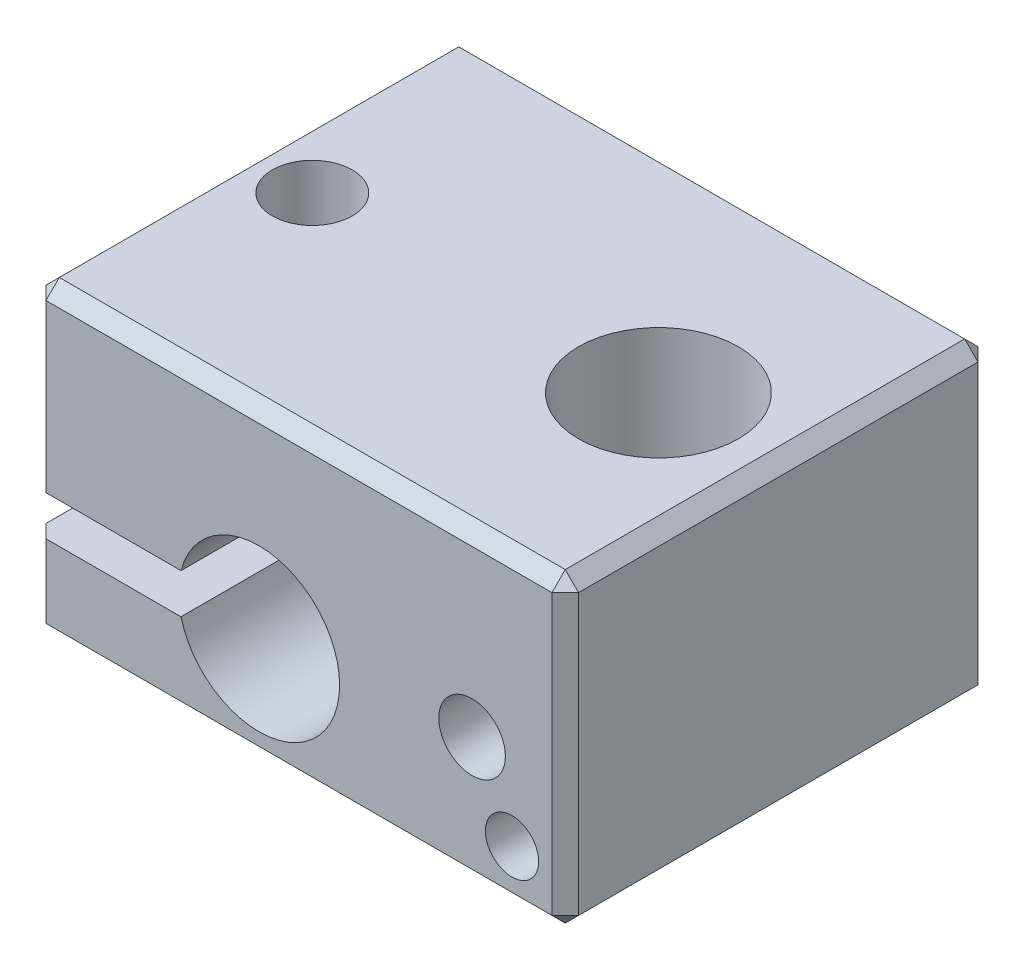
ISO-10303-21;
HEADER;
FILE_DESCRIPTION(('STEP AP214'),'2;1');
FILE_NAME('part.step','',(''),(''),'','','');
FILE_SCHEMA(('AUTOMOTIVE_DESIGN { 1 0 10303 214 1 1 1 1 }'));
ENDSEC;
DATA;
#1=APPLICATION_CONTEXT('core data for automotive mechanical design processes');
#2=APPLICATION_PROTOCOL_DEFINITION('international standard','automotive_design',2000,#1);
#3=PRODUCT_CONTEXT('',#1,'mechanical');
#4=PRODUCT('Part','Part','',(#3));
#5=PRODUCT_RELATED_PRODUCT_CATEGORY('part','',(#4));
#6=PRODUCT_DEFINITION_FORMATION('','',#4);
#7=PRODUCT_DEFINITION_CONTEXT('part definition',#1,'design');
#8=PRODUCT_DEFINITION('design','',#6,#7);
#9=PRODUCT_DEFINITION_SHAPE('','',#8);
#10=(LENGTH_UNIT() NAMED_UNIT(*) SI_UNIT(.MILLI.,.METRE.));
#11=(NAMED_UNIT(*) PLANE_ANGLE_UNIT() SI_UNIT($,.RADIAN.));
#12=(NAMED_UNIT(*) SI_UNIT($,.STERADIAN.) SOLID_ANGLE_UNIT());
#13=UNCERTAINTY_MEASURE_WITH_UNIT(LENGTH_MEASURE(1.E-05),#10,'distance_accuracy_value','');
#14=(GEOMETRIC_REPRESENTATION_CONTEXT(3) GLOBAL_UNCERTAINTY_ASSIGNED_CONTEXT((#13)) GLOBAL_UNIT_ASSIGNED_CONTEXT((#10,
#11,#12)) REPRESENTATION_CONTEXT('',''));
#15=CARTESIAN_POINT('',(0.,0.,0.));
#16=DIRECTION('',(0.,0.,1.));
#17=DIRECTION('',(1.,0.,0.));
#18=AXIS2_PLACEMENT_3D('',#15,#16,#17);
#19=CARTESIAN_POINT('',(0.,0.,16.));
#20=DIRECTION('',(-1.,0.,0.));
#21=DIRECTION('',(0.,0.,1.));
#22=AXIS2_PLACEMENT_3D('',#19,#20,#21);
#23=PLANE('',#22);
#24=DIRECTION('',(0.,-1.,0.));
#25=VECTOR('',#24,1.);
#26=CARTESIAN_POINT('',(0.,0.,15.5));
#27=LINE('',#26,#25);
#28=CARTESIAN_POINT('',(0.,11.,15.5));
#29=VERTEX_POINT('',#28);
#30=CARTESIAN_POINT('',(0.,0.500000000000004,15.5));
#31=VERTEX_POINT('',#30);
#32=EDGE_CURVE('E289',#29,#31,#27,.T.);
#33=ORIENTED_EDGE('',*,*,#32,.T.);
#34=DIRECTION('',(0.,0.,-1.));
#35=VECTOR('',#34,1.);
#36=CARTESIAN_POINT('',(0.,0.500000000000004,16.));
#37=LINE('',#36,#35);
#38=CARTESIAN_POINT('',(0.,0.500000000000004,0.500000000000004));
#39=VERTEX_POINT('',#38);
#40=EDGE_CURVE('E291',#31,#39,#37,.T.);
#41=ORIENTED_EDGE('',*,*,#40,.T.);
#42=DIRECTION('',(0.,1.,0.));
#43=VECTOR('',#42,1.);
#44=CARTESIAN_POINT('',(0.,0.,0.500000000000004));
#45=LINE('',#44,#43);
#46=CARTESIAN_POINT('',(0.,11.,0.500000000000004));
#47=VERTEX_POINT('',#46);
#48=EDGE_CURVE('E287',#39,#47,#45,.T.);
#49=ORIENTED_EDGE('',*,*,#48,.T.);
#50=DIRECTION('',(0.,0.,1.));
#51=VECTOR('',#50,1.);
#52=CARTESIAN_POINT('',(0.,11.,16.));
#53=LINE('',#52,#51);
#54=EDGE_CURVE('E285',#47,#29,#53,.T.);
#55=ORIENTED_EDGE('',*,*,#54,.T.);
#56=EDGE_LOOP('',(#33,#41,#49,#55));
#57=FACE_BOUND('',#56,.T.);
#58=ADVANCED_FACE('F39',(#57),#23,.F.);
#59=CARTESIAN_POINT('',(0.,11.5,16.));
#60=DIRECTION('',(0.,-1.,0.));
#61=DIRECTION('',(1.,0.,0.));
#62=AXIS2_PLACEMENT_3D('',#59,#60,#61);
#63=PLANE('',#62);
#64=DIRECTION('',(-1.,0.,0.));
#65=VECTOR('',#64,1.);
#66=CARTESIAN_POINT('',(0.,11.5,0.500000000000004));
#67=LINE('',#66,#65);
#68=CARTESIAN_POINT('',(-0.500000000000004,11.5,0.500000000000004));
#69=VERTEX_POINT('',#68);
#70=CARTESIAN_POINT('',(-19.5,11.5,0.500000000000004));
#71=VERTEX_POINT('',#70);
#72=EDGE_CURVE('E48',#69,#71,#67,.T.);
#73=ORIENTED_EDGE('',*,*,#72,.T.);
#74=DIRECTION('',(0.,0.,1.));
#75=VECTOR('',#74,1.);
#76=CARTESIAN_POINT('',(-19.5,11.5,16.));
#77=LINE('',#76,#75);
#78=CARTESIAN_POINT('',(-19.5,11.5,15.5));
#79=VERTEX_POINT('',#78);
#80=EDGE_CURVE('E11',#71,#79,#77,.T.);
#81=ORIENTED_EDGE('',*,*,#80,.T.);
#82=DIRECTION('',(1.,0.,0.));
#83=VECTOR('',#82,1.);
#84=CARTESIAN_POINT('',(0.,11.5,15.5));
#85=LINE('',#84,#83);
#86=CARTESIAN_POINT('',(-0.500000000000004,11.5,15.5));
#87=VERTEX_POINT('',#86);
#88=EDGE_CURVE('E294',#79,#87,#85,.T.);
#89=ORIENTED_EDGE('',*,*,#88,.T.);
#90=DIRECTION('',(0.,0.,-1.));
#91=VECTOR('',#90,1.);
#92=CARTESIAN_POINT('',(-0.500000000000004,11.5,16.));
#93=LINE('',#92,#91);
#94=EDGE_CURVE('E59',#87,#69,#93,.T.);
#95=ORIENTED_EDGE('',*,*,#94,.T.);
#96=EDGE_LOOP('',(#73,#81,#89,#95));
#97=FACE_BOUND('',#96,.T.);
#98=CARTESIAN_POINT('',(-4.5,11.5,8.));
#99=DIRECTION('',(0.,1.,0.));
#100=DIRECTION('',(-1.,0.,0.));
#101=AXIS2_PLACEMENT_3D('',#98,#99,#100);
#102=CIRCLE('',#101,3.);
#103=CARTESIAN_POINT('',(-7.5,11.5,8.));
#104=VERTEX_POINT('',#103);
#105=EDGE_CURVE('E191',#104,#104,#102,.T.);
#106=ORIENTED_EDGE('',*,*,#105,.F.);
#107=EDGE_LOOP('',(#106));
#108=FACE_BOUND('',#107,.T.);
#109=CARTESIAN_POINT('',(-17.5,11.5,8.));
#110=DIRECTION('',(0.,1.,0.));
#111=DIRECTION('',(-1.,0.,0.));
#112=AXIS2_PLACEMENT_3D('',#109,#110,#111);
#113=CIRCLE('',#112,1.5);
#114=CARTESIAN_POINT('',(-19.,11.5,8.));
#115=VERTEX_POINT('',#114);
#116=EDGE_CURVE('E197',#115,#115,#113,.T.);
#117=ORIENTED_EDGE('',*,*,#116,.F.);
#118=EDGE_LOOP('',(#117));
#119=FACE_BOUND('',#118,.T.);
#120=ADVANCED_FACE('F387',(#97,#108,#119),#63,.F.);
#121=CARTESIAN_POINT('',(-20.,4.75,16.));
#122=DIRECTION('',(1.,0.,0.));
#123=DIRECTION('',(0.,1.,0.));
#124=AXIS2_PLACEMENT_3D('',#121,#122,#123);
#125=PLANE('',#124);
#126=DIRECTION('',(0.,0.,-1.));
#127=VECTOR('',#126,1.);
#128=CARTESIAN_POINT('',(-20.,11.,16.));
#129=LINE('',#128,#127);
#130=CARTESIAN_POINT('',(-20.,11.,15.5));
#131=VERTEX_POINT('',#130);
#132=CARTESIAN_POINT('',(-20.,11.,0.500000000000004));
#133=VERTEX_POINT('',#132);
#134=EDGE_CURVE('E265',#131,#133,#129,.T.);
#135=ORIENTED_EDGE('',*,*,#134,.T.);
#136=DIRECTION('',(0.,-1.,0.));
#137=VECTOR('',#136,1.);
#138=CARTESIAN_POINT('',(-20.,4.75,0.500000000000004));
#139=LINE('',#138,#137);
#140=CARTESIAN_POINT('',(-20.,4.75,0.500000000000008));
#141=VERTEX_POINT('',#140);
#142=EDGE_CURVE('E269',#133,#141,#139,.T.);
#143=ORIENTED_EDGE('',*,*,#142,.T.);
#144=DIRECTION('',(0.,0.,-1.));
#145=VECTOR('',#144,1.);
#146=CARTESIAN_POINT('',(-20.,4.75,16.));
#147=LINE('',#146,#145);
#148=CARTESIAN_POINT('',(-20.,4.75,15.5));
#149=VERTEX_POINT('',#148);
#150=EDGE_CURVE('E232',#149,#141,#147,.T.);
#151=ORIENTED_EDGE('',*,*,#150,.F.);
#152=DIRECTION('',(0.,1.,0.));
#153=VECTOR('',#152,1.);
#154=CARTESIAN_POINT('',(-20.,11.5,15.5));
#155=LINE('',#154,#153);
#156=EDGE_CURVE('E267',#149,#131,#155,.T.);
#157=ORIENTED_EDGE('',*,*,#156,.T.);
#158=EDGE_LOOP('',(#135,#143,#151,#157));
#159=FACE_BOUND('',#158,.T.);
#160=ADVANCED_FACE('F393',(#159),#125,.F.);
#161=CARTESIAN_POINT('',(-20.,4.75,16.));
#162=DIRECTION('',(0.,1.,0.));
#163=DIRECTION('',(0.,0.,1.));
#164=AXIS2_PLACEMENT_3D('',#161,#162,#163);
#165=PLANE('',#164);
#166=CARTESIAN_POINT('',(-17.5,4.75,8.));
#167=DIRECTION('',(0.,1.,0.));
#168=DIRECTION('',(0.,0.,1.));
#169=AXIS2_PLACEMENT_3D('',#166,#167,#168);
#170=CIRCLE('',#169,1.5);
#171=CARTESIAN_POINT('',(-17.5,4.75,9.5));
#172=VERTEX_POINT('',#171);
#173=EDGE_CURVE('E206',#172,#172,#170,.T.);
#174=ORIENTED_EDGE('',*,*,#173,.T.);
#175=EDGE_LOOP('',(#174));
#176=FACE_BOUND('',#175,.T.);
#177=ORIENTED_EDGE('',*,*,#150,.T.);
#178=DIRECTION('',(-0.707106781186545,0.,0.70710678118655));
#179=VECTOR('',#178,1.);
#180=CARTESIAN_POINT('',(-20.,4.75,0.500000000000004));
#181=LINE('',#180,#179);
#182=CARTESIAN_POINT('',(-19.5,4.75,0.));
#183=VERTEX_POINT('',#182);
#184=EDGE_CURVE('E273',#141,#183,#181,.F.);
#185=ORIENTED_EDGE('',*,*,#184,.T.);
#186=DIRECTION('',(1.,0.,0.));
#187=VECTOR('',#186,1.);
#188=CARTESIAN_POINT('',(-20.,4.75,0.));
#189=LINE('',#188,#187);
#190=CARTESIAN_POINT('',(-14.4305502896214,4.75,0.));
#191=VERTEX_POINT('',#190);
#192=EDGE_CURVE('E209',#183,#191,#189,.T.);
#193=ORIENTED_EDGE('',*,*,#192,.T.);
#194=DIRECTION('',(0.,0.,-1.));
#195=VECTOR('',#194,1.);
#196=CARTESIAN_POINT('',(-14.4305502896214,4.75,16.));
#197=LINE('',#196,#195);
#198=CARTESIAN_POINT('',(-14.4305502896214,4.75,16.));
#199=VERTEX_POINT('',#198);
#200=EDGE_CURVE('E229',#199,#191,#197,.T.);
#201=ORIENTED_EDGE('',*,*,#200,.F.);
#202=DIRECTION('',(1.,0.,0.));
#203=VECTOR('',#202,1.);
#204=CARTESIAN_POINT('',(-20.,4.75,16.));
#205=LINE('',#204,#203);
#206=CARTESIAN_POINT('',(-19.5,4.75,16.));
#207=VERTEX_POINT('',#206);
#208=EDGE_CURVE('E210',#207,#199,#205,.T.);
#209=ORIENTED_EDGE('',*,*,#208,.F.);
#210=DIRECTION('',(-0.707106781186545,0.,-0.70710678118655));
#211=VECTOR('',#210,1.);
#212=CARTESIAN_POINT('',(-19.5,4.75,16.));
#213=LINE('',#212,#211);
#214=EDGE_CURVE('E271',#207,#149,#213,.T.);
#215=ORIENTED_EDGE('',*,*,#214,.T.);
#216=EDGE_LOOP('',(#177,#185,#193,#201,#209,#215));
#217=FACE_BOUND('',#216,.T.);
#218=ADVANCED_FACE('F493',(#176,#217),#165,.F.);
#219=CARTESIAN_POINT('',(-11.5,4.,16.));
#220=DIRECTION('',(0.,0.,-1.));
#221=DIRECTION('',(-1.,0.,0.));
#222=AXIS2_PLACEMENT_3D('',#219,#220,#221);
#223=CYLINDRICAL_SURFACE('',#222,3.025);
#224=CARTESIAN_POINT('',(-11.5,4.,0.));
#225=DIRECTION('',(0.,0.,-1.));
#226=DIRECTION('',(1.,0.,0.));
#227=AXIS2_PLACEMENT_3D('',#224,#225,#226);
#228=CIRCLE('',#227,3.025);
#229=CARTESIAN_POINT('',(-14.4305502896214,3.25,0.));
#230=VERTEX_POINT('',#229);
#231=EDGE_CURVE('E220',#191,#230,#228,.T.);
#232=ORIENTED_EDGE('',*,*,#231,.T.);
#233=DIRECTION('',(0.,0.,-1.));
#234=VECTOR('',#233,1.);
#235=CARTESIAN_POINT('',(-14.4305502896214,3.25,16.));
#236=LINE('',#235,#234);
#237=CARTESIAN_POINT('',(-14.4305502896214,3.25,16.));
#238=VERTEX_POINT('',#237);
#239=EDGE_CURVE('E226',#238,#230,#236,.T.);
#240=ORIENTED_EDGE('',*,*,#239,.F.);
#241=CARTESIAN_POINT('',(-11.5,4.,16.));
#242=DIRECTION('',(0.,0.,-1.));
#243=DIRECTION('',(1.,0.,0.));
#244=AXIS2_PLACEMENT_3D('',#241,#242,#243);
#245=CIRCLE('',#244,3.025);
#246=EDGE_CURVE('E212',#199,#238,#245,.T.);
#247=ORIENTED_EDGE('',*,*,#246,.F.);
#248=ORIENTED_EDGE('',*,*,#200,.T.);
#249=EDGE_LOOP('',(#232,#240,#247,#248));
#250=FACE_BOUND('',#249,.T.);
#251=ADVANCED_FACE('F501',(#250),#223,.F.);
#252=CARTESIAN_POINT('',(-14.4305502896214,3.25,16.));
#253=DIRECTION('',(0.,-1.,0.));
#254=DIRECTION('',(1.,0.,0.));
#255=AXIS2_PLACEMENT_3D('',#252,#253,#254);
#256=PLANE('',#255);
#257=CARTESIAN_POINT('',(-17.5,3.25,8.));
#258=DIRECTION('',(0.,-1.,0.));
#259=DIRECTION('',(1.,0.,0.));
#260=AXIS2_PLACEMENT_3D('',#257,#258,#259);
#261=CIRCLE('',#260,1.5);
#262=CARTESIAN_POINT('',(-16.,3.25,8.));
#263=VERTEX_POINT('',#262);
#264=EDGE_CURVE('E203',#263,#263,#261,.T.);
#265=ORIENTED_EDGE('',*,*,#264,.T.);
#266=EDGE_LOOP('',(#265));
#267=FACE_BOUND('',#266,.T.);
#268=DIRECTION('',(-1.,0.,0.));
#269=VECTOR('',#268,1.);
#270=CARTESIAN_POINT('',(-14.4305502896214,3.25,0.));
#271=LINE('',#270,#269);
#272=CARTESIAN_POINT('',(-19.5,3.25,0.));
#273=VERTEX_POINT('',#272);
#274=EDGE_CURVE('E213',#230,#273,#271,.T.);
#275=ORIENTED_EDGE('',*,*,#274,.T.);
#276=DIRECTION('',(0.707106781186548,0.,-0.707106781186548));
#277=VECTOR('',#276,1.);
#278=CARTESIAN_POINT('',(-20.,3.25,0.500000000000004));
#279=LINE('',#278,#277);
#280=CARTESIAN_POINT('',(-20.,3.25,0.500000000000008));
#281=VERTEX_POINT('',#280);
#282=EDGE_CURVE('E263',#273,#281,#279,.F.);
#283=ORIENTED_EDGE('',*,*,#282,.T.);
#284=DIRECTION('',(0.,0.,-1.));
#285=VECTOR('',#284,1.);
#286=CARTESIAN_POINT('',(-20.,3.25,16.));
#287=LINE('',#286,#285);
#288=CARTESIAN_POINT('',(-20.,3.25,15.5));
#289=VERTEX_POINT('',#288);
#290=EDGE_CURVE('E218',#289,#281,#287,.T.);
#291=ORIENTED_EDGE('',*,*,#290,.F.);
#292=DIRECTION('',(0.707106781186548,0.,0.707106781186548));
#293=VECTOR('',#292,1.);
#294=CARTESIAN_POINT('',(-19.5,3.25,16.));
#295=LINE('',#294,#293);
#296=CARTESIAN_POINT('',(-19.5,3.25,16.));
#297=VERTEX_POINT('',#296);
#298=EDGE_CURVE('E261',#289,#297,#295,.T.);
#299=ORIENTED_EDGE('',*,*,#298,.T.);
#300=DIRECTION('',(-1.,0.,0.));
#301=VECTOR('',#300,1.);
#302=CARTESIAN_POINT('',(-14.4305502896214,3.25,16.));
#303=LINE('',#302,#301);
#304=EDGE_CURVE('E215',#238,#297,#303,.T.);
#305=ORIENTED_EDGE('',*,*,#304,.F.);
#306=ORIENTED_EDGE('',*,*,#239,.T.);
#307=EDGE_LOOP('',(#275,#283,#291,#299,#305,#306));
#308=FACE_BOUND('',#307,.T.);
#309=ADVANCED_FACE('F505',(#267,#308),#256,.F.);
#310=CARTESIAN_POINT('',(-20.,0.,16.));
#311=DIRECTION('',(1.,0.,0.));
#312=DIRECTION('',(0.,0.,-1.));
#313=AXIS2_PLACEMENT_3D('',#310,#311,#312);
#314=PLANE('',#313);
#315=ORIENTED_EDGE('',*,*,#290,.T.);
#316=DIRECTION('',(0.,-1.,0.));
#317=VECTOR('',#316,1.);
#318=CARTESIAN_POINT('',(-20.,0.,0.500000000000004));
#319=LINE('',#318,#317);
#320=CARTESIAN_POINT('',(-20.,0.500000000000002,0.500000000000004));
#321=VERTEX_POINT('',#320);
#322=EDGE_CURVE('E259',#281,#321,#319,.T.);
#323=ORIENTED_EDGE('',*,*,#322,.T.);
#324=DIRECTION('',(0.,0.,1.));
#325=VECTOR('',#324,1.);
#326=CARTESIAN_POINT('',(-20.,0.500000000000002,16.));
#327=LINE('',#326,#325);
#328=CARTESIAN_POINT('',(-20.,0.500000000000002,15.5));
#329=VERTEX_POINT('',#328);
#330=EDGE_CURVE('E257',#321,#329,#327,.T.);
#331=ORIENTED_EDGE('',*,*,#330,.T.);
#332=DIRECTION('',(0.,1.,0.));
#333=VECTOR('',#332,1.);
#334=CARTESIAN_POINT('',(-20.,3.25,15.5));
#335=LINE('',#334,#333);
#336=EDGE_CURVE('E255',#329,#289,#335,.T.);
#337=ORIENTED_EDGE('',*,*,#336,.T.);
#338=EDGE_LOOP('',(#315,#323,#331,#337));
#339=FACE_BOUND('',#338,.T.);
#340=ADVANCED_FACE('F554',(#339),#314,.F.);
#341=CARTESIAN_POINT('',(0.,0.,16.));
#342=DIRECTION('',(0.,1.,0.));
#343=DIRECTION('',(-1.,0.,0.));
#344=AXIS2_PLACEMENT_3D('',#341,#342,#343);
#345=PLANE('',#344);
#346=DIRECTION('',(0.,0.,-1.));
#347=VECTOR('',#346,1.);
#348=CARTESIAN_POINT('',(-19.5,0.,16.));
#349=LINE('',#348,#347);
#350=CARTESIAN_POINT('',(-19.5,0.,15.5));
#351=VERTEX_POINT('',#350);
#352=CARTESIAN_POINT('',(-19.5,0.,0.500000000000004));
#353=VERTEX_POINT('',#352);
#354=EDGE_CURVE('E239',#351,#353,#349,.T.);
#355=ORIENTED_EDGE('',*,*,#354,.T.);
#356=DIRECTION('',(1.,0.,0.));
#357=VECTOR('',#356,1.);
#358=CARTESIAN_POINT('',(0.,0.,0.500000000000004));
#359=LINE('',#358,#357);
#360=CARTESIAN_POINT('',(-0.500000000000004,0.,0.500000000000004));
#361=VERTEX_POINT('',#360);
#362=EDGE_CURVE('E241',#353,#361,#359,.T.);
#363=ORIENTED_EDGE('',*,*,#362,.T.);
#364=DIRECTION('',(0.,0.,1.));
#365=VECTOR('',#364,1.);
#366=CARTESIAN_POINT('',(-0.500000000000004,0.,16.));
#367=LINE('',#366,#365);
#368=CARTESIAN_POINT('',(-0.500000000000004,0.,15.5));
#369=VERTEX_POINT('',#368);
#370=EDGE_CURVE('E234',#361,#369,#367,.T.);
#371=ORIENTED_EDGE('',*,*,#370,.T.);
#372=DIRECTION('',(-1.,0.,0.));
#373=VECTOR('',#372,1.);
#374=CARTESIAN_POINT('',(-20.,0.,15.5));
#375=LINE('',#374,#373);
#376=EDGE_CURVE('E237',#369,#351,#375,.T.);
#377=ORIENTED_EDGE('',*,*,#376,.T.);
#378=EDGE_LOOP('',(#355,#363,#371,#377));
#379=FACE_BOUND('',#378,.T.);
#380=CARTESIAN_POINT('',(-4.5,0.,8.));
#381=DIRECTION('',(0.,1.,0.));
#382=DIRECTION('',(-1.,0.,0.));
#383=AXIS2_PLACEMENT_3D('',#380,#381,#382);
#384=CIRCLE('',#383,3.);
#385=CARTESIAN_POINT('',(-7.5,0.,8.));
#386=VERTEX_POINT('',#385);
#387=EDGE_CURVE('E194',#386,#386,#384,.F.);
#388=ORIENTED_EDGE('',*,*,#387,.F.);
#389=EDGE_LOOP('',(#388));
#390=FACE_BOUND('',#389,.T.);
#391=CARTESIAN_POINT('',(-17.5,0.,8.));
#392=DIRECTION('',(0.,1.,0.));
#393=DIRECTION('',(-1.,0.,0.));
#394=AXIS2_PLACEMENT_3D('',#391,#392,#393);
#395=CIRCLE('',#394,1.5);
#396=CARTESIAN_POINT('',(-19.,0.,8.));
#397=VERTEX_POINT('',#396);
#398=EDGE_CURVE('E200',#397,#397,#395,.F.);
#399=ORIENTED_EDGE('',*,*,#398,.F.);
#400=EDGE_LOOP('',(#399));
#401=FACE_BOUND('',#400,.T.);
#402=ADVANCED_FACE('F546',(#379,#390,#401),#345,.F.);
#403=CARTESIAN_POINT('',(-11.5,4.,16.));
#404=DIRECTION('',(0.,0.,1.));
#405=DIRECTION('',(1.,0.,0.));
#406=AXIS2_PLACEMENT_3D('',#403,#404,#405);
#407=PLANE('',#406);
#408=CARTESIAN_POINT('',(-2.,2.,16.));
#409=DIRECTION('',(0.,0.,1.));
#410=DIRECTION('',(1.,0.,0.));
#411=AXIS2_PLACEMENT_3D('',#408,#409,#410);
#412=CIRCLE('',#411,1.);
#413=CARTESIAN_POINT('',(-0.999999999999999,2.,16.));
#414=VERTEX_POINT('',#413);
#415=EDGE_CURVE('E366',#414,#414,#412,.T.);
#416=ORIENTED_EDGE('',*,*,#415,.F.);
#417=EDGE_LOOP('',(#416));
#418=FACE_BOUND('',#417,.T.);
#419=CARTESIAN_POINT('',(-3.5,4.8,16.));
#420=DIRECTION('',(0.,0.,1.));
#421=DIRECTION('',(1.,0.,0.));
#422=AXIS2_PLACEMENT_3D('',#419,#420,#421);
#423=CIRCLE('',#422,1.24999999999999);
#424=CARTESIAN_POINT('',(-2.25000000000001,4.8,16.));
#425=VERTEX_POINT('',#424);
#426=EDGE_CURVE('E177',#425,#425,#423,.T.);
#427=ORIENTED_EDGE('',*,*,#426,.F.);
#428=EDGE_LOOP('',(#427));
#429=FACE_BOUND('',#428,.T.);
#430=DIRECTION('',(-1.,0.,0.));
#431=VECTOR('',#430,1.);
#432=CARTESIAN_POINT('',(-20.,11.,16.));
#433=LINE('',#432,#431);
#434=CARTESIAN_POINT('',(-0.500000000000004,11.,16.));
#435=VERTEX_POINT('',#434);
#436=CARTESIAN_POINT('',(-19.5,11.,16.));
#437=VERTEX_POINT('',#436);
#438=EDGE_CURVE('E275',#435,#437,#433,.T.);
#439=ORIENTED_EDGE('',*,*,#438,.T.);
#440=DIRECTION('',(0.,-1.,0.));
#441=VECTOR('',#440,1.);
#442=CARTESIAN_POINT('',(-19.5,4.75,16.));
#443=LINE('',#442,#441);
#444=EDGE_CURVE('E283',#437,#207,#443,.T.);
#445=ORIENTED_EDGE('',*,*,#444,.T.);
#446=ORIENTED_EDGE('',*,*,#208,.T.);
#447=ORIENTED_EDGE('',*,*,#246,.T.);
#448=ORIENTED_EDGE('',*,*,#304,.T.);
#449=DIRECTION('',(0.,-1.,0.));
#450=VECTOR('',#449,1.);
#451=CARTESIAN_POINT('',(-19.5,0.,16.));
#452=LINE('',#451,#450);
#453=CARTESIAN_POINT('',(-19.5,0.500000000000002,16.));
#454=VERTEX_POINT('',#453);
#455=EDGE_CURVE('E281',#297,#454,#452,.T.);
#456=ORIENTED_EDGE('',*,*,#455,.T.);
#457=DIRECTION('',(1.,0.,0.));
#458=VECTOR('',#457,1.);
#459=CARTESIAN_POINT('',(0.,0.500000000000004,16.));
#460=LINE('',#459,#458);
#461=CARTESIAN_POINT('',(-0.500000000000004,0.500000000000004,16.));
#462=VERTEX_POINT('',#461);
#463=EDGE_CURVE('E279',#454,#462,#460,.T.);
#464=ORIENTED_EDGE('',*,*,#463,.T.);
#465=DIRECTION('',(0.,1.,0.));
#466=VECTOR('',#465,1.);
#467=CARTESIAN_POINT('',(-0.500000000000004,11.5,16.));
#468=LINE('',#467,#466);
#469=EDGE_CURVE('E277',#462,#435,#468,.T.);
#470=ORIENTED_EDGE('',*,*,#469,.T.);
#471=EDGE_LOOP('',(#439,#445,#446,#447,#448,#456,#464,#470));
#472=FACE_BOUND('',#471,.T.);
#473=ADVANCED_FACE('F511',(#418,#429,#472),#407,.T.);
#474=CARTESIAN_POINT('',(-11.5,4.,0.));
#475=DIRECTION('',(0.,0.,1.));
#476=DIRECTION('',(1.,0.,0.));
#477=AXIS2_PLACEMENT_3D('',#474,#475,#476);
#478=PLANE('',#477);
#479=DIRECTION('',(-1.,0.,0.));
#480=VECTOR('',#479,1.);
#481=CARTESIAN_POINT('',(-11.5,0.500000000000003,0.));
#482=LINE('',#481,#480);
#483=CARTESIAN_POINT('',(-0.500000000000004,0.500000000000004,0.));
#484=VERTEX_POINT('',#483);
#485=CARTESIAN_POINT('',(-19.5,0.500000000000002,0.));
#486=VERTEX_POINT('',#485);
#487=EDGE_CURVE('E250',#484,#486,#482,.T.);
#488=ORIENTED_EDGE('',*,*,#487,.T.);
#489=DIRECTION('',(0.,1.,0.));
#490=VECTOR('',#489,1.);
#491=CARTESIAN_POINT('',(-19.5,4.,0.));
#492=LINE('',#491,#490);
#493=EDGE_CURVE('E253',#486,#273,#492,.T.);
#494=ORIENTED_EDGE('',*,*,#493,.T.);
#495=ORIENTED_EDGE('',*,*,#274,.F.);
#496=ORIENTED_EDGE('',*,*,#231,.F.);
#497=ORIENTED_EDGE('',*,*,#192,.F.);
#498=DIRECTION('',(0.,1.,0.));
#499=VECTOR('',#498,1.);
#500=CARTESIAN_POINT('',(-19.5,3.99999999999999,0.));
#501=LINE('',#500,#499);
#502=CARTESIAN_POINT('',(-19.5,11.,0.));
#503=VERTEX_POINT('',#502);
#504=EDGE_CURVE('E248',#183,#503,#501,.T.);
#505=ORIENTED_EDGE('',*,*,#504,.T.);
#506=DIRECTION('',(1.,0.,0.));
#507=VECTOR('',#506,1.);
#508=CARTESIAN_POINT('',(-11.5,11.,0.));
#509=LINE('',#508,#507);
#510=CARTESIAN_POINT('',(-0.500000000000004,11.,0.));
#511=VERTEX_POINT('',#510);
#512=EDGE_CURVE('E244',#503,#511,#509,.T.);
#513=ORIENTED_EDGE('',*,*,#512,.T.);
#514=DIRECTION('',(0.,-1.,0.));
#515=VECTOR('',#514,1.);
#516=CARTESIAN_POINT('',(-0.500000000000004,4.,0.));
#517=LINE('',#516,#515);
#518=EDGE_CURVE('E246',#511,#484,#517,.T.);
#519=ORIENTED_EDGE('',*,*,#518,.T.);
#520=EDGE_LOOP('',(#488,#494,#495,#496,#497,#505,#513,#519));
#521=FACE_BOUND('',#520,.T.);
#522=ADVANCED_FACE('F497',(#521),#478,.F.);
#523=CARTESIAN_POINT('',(-17.5,-8.48528137423857,8.));
#524=DIRECTION('',(0.,1.,0.));
#525=DIRECTION('',(-1.,0.,0.));
#526=AXIS2_PLACEMENT_3D('',#523,#524,#525);
#527=CYLINDRICAL_SURFACE('',#526,1.5);
#528=ORIENTED_EDGE('',*,*,#398,.T.);
#529=EDGE_LOOP('',(#528));
#530=FACE_BOUND('',#529,.T.);
#531=ORIENTED_EDGE('',*,*,#264,.F.);
#532=EDGE_LOOP('',(#531));
#533=FACE_BOUND('',#532,.T.);
#534=ADVANCED_FACE('F616',(#530,#533),#527,.F.);
#535=ORIENTED_EDGE('',*,*,#116,.T.);
#536=EDGE_LOOP('',(#535));
#537=FACE_BOUND('',#536,.T.);
#538=ORIENTED_EDGE('',*,*,#173,.F.);
#539=EDGE_LOOP('',(#538));
#540=FACE_BOUND('',#539,.T.);
#541=ADVANCED_FACE('F796',(#537,#540),#527,.F.);
#542=CARTESIAN_POINT('',(-4.5,-8.48528137423857,8.));
#543=DIRECTION('',(0.,1.,0.));
#544=DIRECTION('',(-1.,0.,0.));
#545=AXIS2_PLACEMENT_3D('',#542,#543,#544);
#546=CYLINDRICAL_SURFACE('',#545,3.);
#547=ORIENTED_EDGE('',*,*,#387,.T.);
#548=EDGE_LOOP('',(#547));
#549=FACE_BOUND('',#548,.T.);
#550=ORIENTED_EDGE('',*,*,#105,.T.);
#551=EDGE_LOOP('',(#550));
#552=FACE_BOUND('',#551,.T.);
#553=ADVANCED_FACE('F788',(#549,#552),#546,.F.);
#554=CARTESIAN_POINT('',(-3.5,4.8,13.));
#555=DIRECTION('',(0.,0.,1.));
#556=DIRECTION('',(1.,0.,0.));
#557=AXIS2_PLACEMENT_3D('',#554,#555,#556);
#558=CONICAL_SURFACE('',#557,1.24999999999999,1.02974425867665);
#559=CARTESIAN_POINT('',(-3.5,4.8,12.2489242262156));
#560=VERTEX_POINT('',#559);
#561=VERTEX_LOOP('',#560);
#562=FACE_BOUND('',#561,.T.);
#563=CARTESIAN_POINT('',(-3.5,4.8,13.));
#564=DIRECTION('',(0.,0.,1.));
#565=DIRECTION('',(1.,0.,0.));
#566=AXIS2_PLACEMENT_3D('',#563,#564,#565);
#567=CIRCLE('',#566,1.24999999999999);
#568=CARTESIAN_POINT('',(-2.25000000000001,4.8,13.));
#569=VERTEX_POINT('',#568);
#570=EDGE_CURVE('E181',#569,#569,#567,.T.);
#571=ORIENTED_EDGE('',*,*,#570,.T.);
#572=EDGE_LOOP('',(#571));
#573=FACE_BOUND('',#572,.T.);
#574=ADVANCED_FACE('F782',(#562,#573),#558,.F.);
#575=CARTESIAN_POINT('',(-3.5,4.8,16.));
#576=DIRECTION('',(0.,0.,1.));
#577=DIRECTION('',(1.,0.,0.));
#578=AXIS2_PLACEMENT_3D('',#575,#576,#577);
#579=CYLINDRICAL_SURFACE('',#578,1.24999999999999);
#580=ORIENTED_EDGE('',*,*,#570,.F.);
#581=EDGE_LOOP('',(#580));
#582=FACE_BOUND('',#581,.T.);
#583=ORIENTED_EDGE('',*,*,#426,.T.);
#584=EDGE_LOOP('',(#583));
#585=FACE_BOUND('',#584,.T.);
#586=ADVANCED_FACE('F384',(#582,#585),#579,.F.);
#587=CARTESIAN_POINT('',(-2.,2.,14.));
#588=DIRECTION('',(0.,0.,1.));
#589=DIRECTION('',(1.,0.,0.));
#590=AXIS2_PLACEMENT_3D('',#587,#588,#589);
#591=CONICAL_SURFACE('',#590,1.,1.02974425867665);
#592=CARTESIAN_POINT('',(-2.,2.,14.));
#593=DIRECTION('',(0.,0.,1.));
#594=DIRECTION('',(1.,0.,0.));
#595=AXIS2_PLACEMENT_3D('',#592,#593,#594);
#596=CIRCLE('',#595,1.);
#597=CARTESIAN_POINT('',(-0.999999999999999,2.,14.));
#598=VERTEX_POINT('',#597);
#599=EDGE_CURVE('E184',#598,#598,#596,.T.);
#600=ORIENTED_EDGE('',*,*,#599,.T.);
#601=EDGE_LOOP('',(#600));
#602=FACE_BOUND('',#601,.T.);
#603=CARTESIAN_POINT('',(-2.,2.,13.8497848452431));
#604=DIRECTION('',(0.,0.,1.));
#605=DIRECTION('',(1.,0.,0.));
#606=AXIS2_PLACEMENT_3D('',#603,#604,#605);
#607=CIRCLE('',#606,0.749999999999998);
#608=CARTESIAN_POINT('',(-1.25,2.,13.8497848452431));
#609=VERTEX_POINT('',#608);
#610=EDGE_CURVE('E178',#609,#609,#607,.T.);
#611=ORIENTED_EDGE('',*,*,#610,.F.);
#612=EDGE_LOOP('',(#611));
#613=FACE_BOUND('',#612,.T.);
#614=ADVANCED_FACE('F376',(#602,#613),#591,.F.);
#615=CARTESIAN_POINT('',(-2.,2.,16.));
#616=DIRECTION('',(0.,0.,1.));
#617=DIRECTION('',(1.,0.,0.));
#618=AXIS2_PLACEMENT_3D('',#615,#616,#617);
#619=CYLINDRICAL_SURFACE('',#618,1.);
#620=ORIENTED_EDGE('',*,*,#599,.F.);
#621=EDGE_LOOP('',(#620));
#622=FACE_BOUND('',#621,.T.);
#623=ORIENTED_EDGE('',*,*,#415,.T.);
#624=EDGE_LOOP('',(#623));
#625=FACE_BOUND('',#624,.T.);
#626=ADVANCED_FACE('F171',(#622,#625),#619,.F.);
#627=CARTESIAN_POINT('',(-2.,2.,12.));
#628=DIRECTION('',(0.,0.,1.));
#629=DIRECTION('',(1.,0.,0.));
#630=AXIS2_PLACEMENT_3D('',#627,#628,#629);
#631=CONICAL_SURFACE('',#630,0.749999999999998,1.02974425867665);
#632=CARTESIAN_POINT('',(-2.,2.,11.5493545357293));
#633=VERTEX_POINT('',#632);
#634=VERTEX_LOOP('',#633);
#635=FACE_BOUND('',#634,.T.);
#636=CARTESIAN_POINT('',(-2.,2.,12.));
#637=DIRECTION('',(0.,0.,1.));
#638=DIRECTION('',(1.,0.,0.));
#639=AXIS2_PLACEMENT_3D('',#636,#637,#638);
#640=CIRCLE('',#639,0.749999999999998);
#641=CARTESIAN_POINT('',(-1.25,2.,12.));
#642=VERTEX_POINT('',#641);
#643=EDGE_CURVE('E175',#642,#642,#640,.T.);
#644=ORIENTED_EDGE('',*,*,#643,.T.);
#645=EDGE_LOOP('',(#644));
#646=FACE_BOUND('',#645,.T.);
#647=ADVANCED_FACE('F167',(#635,#646),#631,.F.);
#648=CARTESIAN_POINT('',(-2.,2.,16.));
#649=DIRECTION('',(0.,0.,1.));
#650=DIRECTION('',(1.,0.,0.));
#651=AXIS2_PLACEMENT_3D('',#648,#649,#650);
#652=CYLINDRICAL_SURFACE('',#651,0.749999999999998);
#653=ORIENTED_EDGE('',*,*,#610,.T.);
#654=EDGE_LOOP('',(#653));
#655=FACE_BOUND('',#654,.T.);
#656=ORIENTED_EDGE('',*,*,#643,.F.);
#657=EDGE_LOOP('',(#656));
#658=FACE_BOUND('',#657,.T.);
#659=ADVANCED_FACE('F170',(#655,#658),#652,.F.);
#660=CARTESIAN_POINT('',(-19.5,3.99999999999999,16.));
#661=DIRECTION('',(-0.70710678118655,0.,0.707106781186545));
#662=DIRECTION('',(0.,1.,0.));
#663=AXIS2_PLACEMENT_3D('',#660,#661,#662);
#664=PLANE('',#663);
#665=DIRECTION('',(0.707106781186545,0.,0.70710678118655));
#666=VECTOR('',#665,1.);
#667=CARTESIAN_POINT('',(-20.,11.,15.5));
#668=LINE('',#667,#666);
#669=EDGE_CURVE('E43',#131,#437,#668,.T.);
#670=ORIENTED_EDGE('',*,*,#669,.F.);
#671=ORIENTED_EDGE('',*,*,#156,.F.);
#672=ORIENTED_EDGE('',*,*,#214,.F.);
#673=ORIENTED_EDGE('',*,*,#444,.F.);
#674=EDGE_LOOP('',(#670,#671,#672,#673));
#675=FACE_BOUND('',#674,.T.);
#676=ADVANCED_FACE('F41',(#675),#664,.T.);
#677=CARTESIAN_POINT('',(-20.,11.,15.5));
#678=DIRECTION('',(-0.577350269189628,0.577350269189628,0.577350269189622));
#679=DIRECTION('',(-0.707106781186548,-0.707106781186548,0.));
#680=AXIS2_PLACEMENT_3D('',#677,#678,#679);
#681=PLANE('',#680);
#682=DIRECTION('',(0.707106781186548,0.707106781186548,0.));
#683=VECTOR('',#682,1.);
#684=CARTESIAN_POINT('',(-20.,11.,15.5));
#685=LINE('',#684,#683);
#686=EDGE_CURVE('E358',#131,#79,#685,.T.);
#687=ORIENTED_EDGE('',*,*,#686,.F.);
#688=ORIENTED_EDGE('',*,*,#669,.T.);
#689=DIRECTION('',(0.,0.707106781186547,-0.707106781186548));
#690=VECTOR('',#689,1.);
#691=CARTESIAN_POINT('',(-19.5,11.25,15.75));
#692=LINE('',#691,#690);
#693=EDGE_CURVE('E360',#79,#437,#692,.F.);
#694=ORIENTED_EDGE('',*,*,#693,.F.);
#695=EDGE_LOOP('',(#687,#688,#694));
#696=FACE_BOUND('',#695,.T.);
#697=ADVANCED_FACE('F475',(#696),#681,.T.);
#698=CARTESIAN_POINT('',(-11.5,11.,16.));
#699=DIRECTION('',(0.,0.707106781186548,0.707106781186547));
#700=DIRECTION('',(1.,0.,0.));
#701=AXIS2_PLACEMENT_3D('',#698,#699,#700);
#702=PLANE('',#701);
#703=ORIENTED_EDGE('',*,*,#693,.T.);
#704=ORIENTED_EDGE('',*,*,#438,.F.);
#705=DIRECTION('',(0.,-0.707106781186547,0.707106781186548));
#706=VECTOR('',#705,1.);
#707=CARTESIAN_POINT('',(-0.500000000000003,11.,16.));
#708=LINE('',#707,#706);
#709=EDGE_CURVE('E355',#87,#435,#708,.T.);
#710=ORIENTED_EDGE('',*,*,#709,.F.);
#711=ORIENTED_EDGE('',*,*,#88,.F.);
#712=EDGE_LOOP('',(#703,#704,#710,#711));
#713=FACE_BOUND('',#712,.T.);
#714=ADVANCED_FACE('F472',(#713),#702,.T.);
#715=CARTESIAN_POINT('',(-20.,11.,16.));
#716=DIRECTION('',(0.707106781186547,-0.707106781186547,0.));
#717=DIRECTION('',(0.,0.,-1.));
#718=AXIS2_PLACEMENT_3D('',#715,#716,#717);
#719=PLANE('',#718);
#720=ORIENTED_EDGE('',*,*,#686,.T.);
#721=ORIENTED_EDGE('',*,*,#80,.F.);
#722=DIRECTION('',(-0.707106781186548,-0.707106781186548,0.));
#723=VECTOR('',#722,1.);
#724=CARTESIAN_POINT('',(-19.75,11.25,0.500000000000004));
#725=LINE('',#724,#723);
#726=EDGE_CURVE('E352',#133,#71,#725,.F.);
#727=ORIENTED_EDGE('',*,*,#726,.F.);
#728=ORIENTED_EDGE('',*,*,#134,.F.);
#729=EDGE_LOOP('',(#720,#721,#727,#728));
#730=FACE_BOUND('',#729,.T.);
#731=ADVANCED_FACE('F468',(#730),#719,.F.);
#732=CARTESIAN_POINT('',(-20.,4.75,0.500000000000004));
#733=DIRECTION('',(0.70710678118655,0.,0.707106781186545));
#734=DIRECTION('',(0.,-1.,0.));
#735=AXIS2_PLACEMENT_3D('',#732,#733,#734);
#736=PLANE('',#735);
#737=ORIENTED_EDGE('',*,*,#184,.F.);
#738=ORIENTED_EDGE('',*,*,#142,.F.);
#739=DIRECTION('',(0.707106781186545,0.,-0.70710678118655));
#740=VECTOR('',#739,1.);
#741=CARTESIAN_POINT('',(-19.5,11.,0.));
#742=LINE('',#741,#740);
#743=EDGE_CURVE('E349',#503,#133,#742,.F.);
#744=ORIENTED_EDGE('',*,*,#743,.F.);
#745=ORIENTED_EDGE('',*,*,#504,.F.);
#746=EDGE_LOOP('',(#737,#738,#744,#745));
#747=FACE_BOUND('',#746,.T.);
#748=ADVANCED_FACE('F464',(#747),#736,.F.);
#749=CARTESIAN_POINT('',(-0.500000000000004,11.,16.));
#750=DIRECTION('',(0.577350269189626,0.577350269189626,0.577350269189625));
#751=DIRECTION('',(-0.707106781186547,0.707106781186547,0.));
#752=AXIS2_PLACEMENT_3D('',#749,#750,#751);
#753=PLANE('',#752);
#754=DIRECTION('',(0.707106781186548,-0.707106781186548,0.));
#755=VECTOR('',#754,1.);
#756=CARTESIAN_POINT('',(-0.250000000000003,11.25,15.5));
#757=LINE('',#756,#755);
#758=EDGE_CURVE('E343',#87,#29,#757,.T.);
#759=ORIENTED_EDGE('',*,*,#758,.F.);
#760=ORIENTED_EDGE('',*,*,#709,.T.);
#761=DIRECTION('',(0.707106781186548,0.,-0.707106781186548));
#762=VECTOR('',#761,1.);
#763=CARTESIAN_POINT('',(-0.500000000000004,11.,16.));
#764=LINE('',#763,#762);
#765=EDGE_CURVE('E346',#29,#435,#764,.F.);
#766=ORIENTED_EDGE('',*,*,#765,.F.);
#767=EDGE_LOOP('',(#759,#760,#766));
#768=FACE_BOUND('',#767,.T.);
#769=ADVANCED_FACE('F460',(#768),#753,.T.);
#770=CARTESIAN_POINT('',(-19.5,11.,0.));
#771=DIRECTION('',(-0.577350269189628,0.577350269189628,-0.577350269189622));
#772=DIRECTION('',(-0.707106781186548,-0.707106781186548,0.));
#773=AXIS2_PLACEMENT_3D('',#770,#771,#772);
#774=PLANE('',#773);
#775=ORIENTED_EDGE('',*,*,#743,.T.);
#776=ORIENTED_EDGE('',*,*,#726,.T.);
#777=DIRECTION('',(0.,0.707106781186547,0.707106781186548));
#778=VECTOR('',#777,1.);
#779=CARTESIAN_POINT('',(-19.5,11.,0.));
#780=LINE('',#779,#778);
#781=EDGE_CURVE('E340',#503,#71,#780,.T.);
#782=ORIENTED_EDGE('',*,*,#781,.F.);
#783=EDGE_LOOP('',(#775,#776,#782));
#784=FACE_BOUND('',#783,.T.);
#785=ADVANCED_FACE('F456',(#784),#774,.T.);
#786=CARTESIAN_POINT('',(-19.5,4.,16.));
#787=DIRECTION('',(-0.707106781186547,0.,0.707106781186547));
#788=DIRECTION('',(0.,1.,0.));
#789=AXIS2_PLACEMENT_3D('',#786,#787,#788);
#790=PLANE('',#789);
#791=ORIENTED_EDGE('',*,*,#298,.F.);
#792=ORIENTED_EDGE('',*,*,#336,.F.);
#793=DIRECTION('',(-0.707106781186547,0.,-0.707106781186547));
#794=VECTOR('',#793,1.);
#795=CARTESIAN_POINT('',(-20.,0.500000000000002,15.5));
#796=LINE('',#795,#794);
#797=EDGE_CURVE('E337',#454,#329,#796,.T.);
#798=ORIENTED_EDGE('',*,*,#797,.F.);
#799=ORIENTED_EDGE('',*,*,#455,.F.);
#800=EDGE_LOOP('',(#791,#792,#798,#799));
#801=FACE_BOUND('',#800,.T.);
#802=ADVANCED_FACE('F452',(#801),#790,.T.);
#803=CARTESIAN_POINT('',(-11.5,0.500000000000003,16.));
#804=DIRECTION('',(0.,-0.707106781186547,0.707106781186548));
#805=DIRECTION('',(-1.,0.,0.));
#806=AXIS2_PLACEMENT_3D('',#803,#804,#805);
#807=PLANE('',#806);
#808=DIRECTION('',(0.,-0.707106781186548,-0.707106781186547));
#809=VECTOR('',#808,1.);
#810=CARTESIAN_POINT('',(-0.500000000000004,0.500000000000004,16.));
#811=LINE('',#810,#809);
#812=EDGE_CURVE('E331',#462,#369,#811,.T.);
#813=ORIENTED_EDGE('',*,*,#812,.F.);
#814=ORIENTED_EDGE('',*,*,#463,.F.);
#815=DIRECTION('',(0.,0.707106781186547,0.707106781186547));
#816=VECTOR('',#815,1.);
#817=CARTESIAN_POINT('',(-19.5,0.25,15.75));
#818=LINE('',#817,#816);
#819=EDGE_CURVE('E334',#351,#454,#818,.T.);
#820=ORIENTED_EDGE('',*,*,#819,.F.);
#821=ORIENTED_EDGE('',*,*,#376,.F.);
#822=EDGE_LOOP('',(#813,#814,#820,#821));
#823=FACE_BOUND('',#822,.T.);
#824=ADVANCED_FACE('F448',(#823),#807,.T.);
#825=CARTESIAN_POINT('',(-0.500000000000004,4.,16.));
#826=DIRECTION('',(0.707106781186547,0.,0.707106781186547));
#827=DIRECTION('',(0.,-1.,0.));
#828=AXIS2_PLACEMENT_3D('',#825,#826,#827);
#829=PLANE('',#828);
#830=ORIENTED_EDGE('',*,*,#765,.T.);
#831=ORIENTED_EDGE('',*,*,#469,.F.);
#832=DIRECTION('',(-0.707106781186548,0.,0.707106781186548));
#833=VECTOR('',#832,1.);
#834=CARTESIAN_POINT('',(-0.500000000000004,0.500000000000004,16.));
#835=LINE('',#834,#833);
#836=EDGE_CURVE('E328',#31,#462,#835,.T.);
#837=ORIENTED_EDGE('',*,*,#836,.F.);
#838=ORIENTED_EDGE('',*,*,#32,.F.);
#839=EDGE_LOOP('',(#830,#831,#837,#838));
#840=FACE_BOUND('',#839,.T.);
#841=ADVANCED_FACE('F444',(#840),#829,.T.);
#842=CARTESIAN_POINT('',(-0.500000000000004,11.5,16.));
#843=DIRECTION('',(-0.707106781186547,-0.707106781186547,0.));
#844=DIRECTION('',(0.,0.,-1.));
#845=AXIS2_PLACEMENT_3D('',#842,#843,#844);
#846=PLANE('',#845);
#847=ORIENTED_EDGE('',*,*,#758,.T.);
#848=ORIENTED_EDGE('',*,*,#54,.F.);
#849=DIRECTION('',(-0.707106781186548,0.707106781186548,0.));
#850=VECTOR('',#849,1.);
#851=CARTESIAN_POINT('',(0.,11.,0.500000000000004));
#852=LINE('',#851,#850);
#853=EDGE_CURVE('E325',#69,#47,#852,.F.);
#854=ORIENTED_EDGE('',*,*,#853,.F.);
#855=ORIENTED_EDGE('',*,*,#94,.F.);
#856=EDGE_LOOP('',(#847,#848,#854,#855));
#857=FACE_BOUND('',#856,.T.);
#858=ADVANCED_FACE('F440',(#857),#846,.F.);
#859=CARTESIAN_POINT('',(0.,11.5,0.500000000000004));
#860=DIRECTION('',(0.,-0.707106781186548,0.707106781186547));
#861=DIRECTION('',(-1.,0.,0.));
#862=AXIS2_PLACEMENT_3D('',#859,#860,#861);
#863=PLANE('',#862);
#864=ORIENTED_EDGE('',*,*,#781,.T.);
#865=ORIENTED_EDGE('',*,*,#72,.F.);
#866=DIRECTION('',(0.,-0.707106781186547,-0.707106781186548));
#867=VECTOR('',#866,1.);
#868=CARTESIAN_POINT('',(-0.500000000000003,11.25,0.250000000000002));
#869=LINE('',#868,#867);
#870=EDGE_CURVE('E322',#511,#69,#869,.F.);
#871=ORIENTED_EDGE('',*,*,#870,.F.);
#872=ORIENTED_EDGE('',*,*,#512,.F.);
#873=EDGE_LOOP('',(#864,#865,#871,#872));
#874=FACE_BOUND('',#873,.T.);
#875=ADVANCED_FACE('F436',(#874),#863,.F.);
#876=CARTESIAN_POINT('',(-20.,0.500000000000002,15.5));
#877=DIRECTION('',(-0.577350269189626,-0.577350269189626,0.577350269189626));
#878=DIRECTION('',(0.707106781186548,0.,0.707106781186547));
#879=AXIS2_PLACEMENT_3D('',#876,#877,#878);
#880=PLANE('',#879);
#881=ORIENTED_EDGE('',*,*,#819,.T.);
#882=ORIENTED_EDGE('',*,*,#797,.T.);
#883=DIRECTION('',(-0.707106781186548,0.707106781186548,0.));
#884=VECTOR('',#883,1.);
#885=CARTESIAN_POINT('',(-20.,0.500000000000002,15.5));
#886=LINE('',#885,#884);
#887=EDGE_CURVE('E319',#351,#329,#886,.T.);
#888=ORIENTED_EDGE('',*,*,#887,.F.);
#889=EDGE_LOOP('',(#881,#882,#888));
#890=FACE_BOUND('',#889,.T.);
#891=ADVANCED_FACE('F432',(#890),#880,.T.);
#892=CARTESIAN_POINT('',(-0.500000000000004,0.500000000000004,16.));
#893=DIRECTION('',(0.577350269189626,-0.577350269189626,0.577350269189626));
#894=DIRECTION('',(0.707106781186548,0.,-0.707106781186547));
#895=AXIS2_PLACEMENT_3D('',#892,#893,#894);
#896=PLANE('',#895);
#897=ORIENTED_EDGE('',*,*,#836,.T.);
#898=ORIENTED_EDGE('',*,*,#812,.T.);
#899=DIRECTION('',(-0.707106781186547,-0.707106781186547,0.));
#900=VECTOR('',#899,1.);
#901=CARTESIAN_POINT('',(-0.250000000000002,0.250000000000002,15.5));
#902=LINE('',#901,#900);
#903=EDGE_CURVE('E316',#31,#369,#902,.T.);
#904=ORIENTED_EDGE('',*,*,#903,.F.);
#905=EDGE_LOOP('',(#897,#898,#904));
#906=FACE_BOUND('',#905,.T.);
#907=ADVANCED_FACE('F428',(#906),#896,.T.);
#908=CARTESIAN_POINT('',(0.,11.,0.500000000000004));
#909=DIRECTION('',(0.577350269189626,0.577350269189626,-0.577350269189625));
#910=DIRECTION('',(-0.707106781186547,0.707106781186547,0.));
#911=AXIS2_PLACEMENT_3D('',#908,#909,#910);
#912=PLANE('',#911);
#913=ORIENTED_EDGE('',*,*,#870,.T.);
#914=ORIENTED_EDGE('',*,*,#853,.T.);
#915=DIRECTION('',(0.707106781186548,0.,0.707106781186548));
#916=VECTOR('',#915,1.);
#917=CARTESIAN_POINT('',(0.,11.,0.500000000000004));
#918=LINE('',#917,#916);
#919=EDGE_CURVE('E313',#511,#47,#918,.T.);
#920=ORIENTED_EDGE('',*,*,#919,.F.);
#921=EDGE_LOOP('',(#913,#914,#920));
#922=FACE_BOUND('',#921,.T.);
#923=ADVANCED_FACE('F424',(#922),#912,.T.);
#924=CARTESIAN_POINT('',(-20.,0.,0.500000000000004));
#925=DIRECTION('',(0.707106781186547,0.,0.707106781186547));
#926=DIRECTION('',(0.,-1.,0.));
#927=AXIS2_PLACEMENT_3D('',#924,#925,#926);
#928=PLANE('',#927);
#929=ORIENTED_EDGE('',*,*,#282,.F.);
#930=ORIENTED_EDGE('',*,*,#493,.F.);
#931=DIRECTION('',(-0.707106781186548,0.,0.707106781186548));
#932=VECTOR('',#931,1.);
#933=CARTESIAN_POINT('',(-19.5,0.500000000000002,0.));
#934=LINE('',#933,#932);
#935=EDGE_CURVE('E310',#321,#486,#934,.F.);
#936=ORIENTED_EDGE('',*,*,#935,.F.);
#937=ORIENTED_EDGE('',*,*,#322,.F.);
#938=EDGE_LOOP('',(#929,#930,#936,#937));
#939=FACE_BOUND('',#938,.T.);
#940=ADVANCED_FACE('F420',(#939),#928,.F.);
#941=CARTESIAN_POINT('',(-19.5,0.,16.));
#942=DIRECTION('',(0.707106781186547,0.707106781186547,0.));
#943=DIRECTION('',(0.,0.,-1.));
#944=AXIS2_PLACEMENT_3D('',#941,#942,#943);
#945=PLANE('',#944);
#946=ORIENTED_EDGE('',*,*,#887,.T.);
#947=ORIENTED_EDGE('',*,*,#330,.F.);
#948=DIRECTION('',(0.707106781186547,-0.707106781186547,0.));
#949=VECTOR('',#948,1.);
#950=CARTESIAN_POINT('',(-19.75,0.25,0.500000000000004));
#951=LINE('',#950,#949);
#952=EDGE_CURVE('E307',#353,#321,#951,.F.);
#953=ORIENTED_EDGE('',*,*,#952,.F.);
#954=ORIENTED_EDGE('',*,*,#354,.F.);
#955=EDGE_LOOP('',(#946,#947,#953,#954));
#956=FACE_BOUND('',#955,.T.);
#957=ADVANCED_FACE('F416',(#956),#945,.F.);
#958=CARTESIAN_POINT('',(0.,0.500000000000004,16.));
#959=DIRECTION('',(-0.707106781186548,0.707106781186547,0.));
#960=DIRECTION('',(0.,0.,-1.));
#961=AXIS2_PLACEMENT_3D('',#958,#959,#960);
#962=PLANE('',#961);
#963=ORIENTED_EDGE('',*,*,#903,.T.);
#964=ORIENTED_EDGE('',*,*,#370,.F.);
#965=DIRECTION('',(0.707106781186547,0.707106781186548,0.));
#966=VECTOR('',#965,1.);
#967=CARTESIAN_POINT('',(-0.500000000000004,0.,0.500000000000004));
#968=LINE('',#967,#966);
#969=EDGE_CURVE('E304',#39,#361,#968,.F.);
#970=ORIENTED_EDGE('',*,*,#969,.F.);
#971=ORIENTED_EDGE('',*,*,#40,.F.);
#972=EDGE_LOOP('',(#963,#964,#970,#971));
#973=FACE_BOUND('',#972,.T.);
#974=ADVANCED_FACE('F412',(#973),#962,.F.);
#975=CARTESIAN_POINT('',(0.,0.,0.500000000000004));
#976=DIRECTION('',(-0.707106781186547,0.,0.707106781186547));
#977=DIRECTION('',(0.,1.,0.));
#978=AXIS2_PLACEMENT_3D('',#975,#976,#977);
#979=PLANE('',#978);
#980=ORIENTED_EDGE('',*,*,#919,.T.);
#981=ORIENTED_EDGE('',*,*,#48,.F.);
#982=DIRECTION('',(-0.707106781186548,0.,-0.707106781186548));
#983=VECTOR('',#982,1.);
#984=CARTESIAN_POINT('',(-0.250000000000002,0.500000000000004,0.250000000000002));
#985=LINE('',#984,#983);
#986=EDGE_CURVE('E302',#484,#39,#985,.F.);
#987=ORIENTED_EDGE('',*,*,#986,.F.);
#988=ORIENTED_EDGE('',*,*,#518,.F.);
#989=EDGE_LOOP('',(#980,#981,#987,#988));
#990=FACE_BOUND('',#989,.T.);
#991=ADVANCED_FACE('F408',(#990),#979,.F.);
#992=CARTESIAN_POINT('',(-19.5,0.500000000000002,0.));
#993=DIRECTION('',(-0.577350269189626,-0.577350269189626,-0.577350269189626));
#994=DIRECTION('',(-0.707106781186548,0.,0.707106781186547));
#995=AXIS2_PLACEMENT_3D('',#992,#993,#994);
#996=PLANE('',#995);
#997=ORIENTED_EDGE('',*,*,#952,.T.);
#998=ORIENTED_EDGE('',*,*,#935,.T.);
#999=DIRECTION('',(0.,0.707106781186548,-0.707106781186547));
#1000=VECTOR('',#999,1.);
#1001=CARTESIAN_POINT('',(-19.5,0.500000000000002,0.));
#1002=LINE('',#1001,#1000);
#1003=EDGE_CURVE('E300',#353,#486,#1002,.T.);
#1004=ORIENTED_EDGE('',*,*,#1003,.F.);
#1005=EDGE_LOOP('',(#997,#998,#1004));
#1006=FACE_BOUND('',#1005,.T.);
#1007=ADVANCED_FACE('F404',(#1006),#996,.T.);
#1008=CARTESIAN_POINT('',(-0.500000000000004,0.,0.500000000000004));
#1009=DIRECTION('',(0.577350269189626,-0.577350269189626,-0.577350269189626));
#1010=DIRECTION('',(-0.707106781186548,0.,-0.707106781186547));
#1011=AXIS2_PLACEMENT_3D('',#1008,#1009,#1010);
#1012=PLANE('',#1011);
#1013=ORIENTED_EDGE('',*,*,#986,.T.);
#1014=ORIENTED_EDGE('',*,*,#969,.T.);
#1015=DIRECTION('',(0.,-0.707106781186548,0.707106781186547));
#1016=VECTOR('',#1015,1.);
#1017=CARTESIAN_POINT('',(-0.500000000000004,0.,0.500000000000004));
#1018=LINE('',#1017,#1016);
#1019=EDGE_CURVE('E298',#484,#361,#1018,.T.);
#1020=ORIENTED_EDGE('',*,*,#1019,.F.);
#1021=EDGE_LOOP('',(#1013,#1014,#1020));
#1022=FACE_BOUND('',#1021,.T.);
#1023=ADVANCED_FACE('F400',(#1022),#1012,.T.);
#1024=CARTESIAN_POINT('',(0.,0.,0.500000000000004));
#1025=DIRECTION('',(0.,0.707106781186547,0.707106781186548));
#1026=DIRECTION('',(1.,0.,0.));
#1027=AXIS2_PLACEMENT_3D('',#1024,#1025,#1026);
#1028=PLANE('',#1027);
#1029=ORIENTED_EDGE('',*,*,#1003,.T.);
#1030=ORIENTED_EDGE('',*,*,#487,.F.);
#1031=ORIENTED_EDGE('',*,*,#1019,.T.);
#1032=ORIENTED_EDGE('',*,*,#362,.F.);
#1033=EDGE_LOOP('',(#1029,#1030,#1031,#1032));
#1034=FACE_BOUND('',#1033,.T.);
#1035=ADVANCED_FACE('F397',(#1034),#1028,.F.);
#1036=CLOSED_SHELL('',(#58,#120,#160,#218,#251,#309,#340,#402,#473,#522,#534,#541,#553,#574,
#586,#614,#626,#647,#659,#676,#697,#714,#731,#748,#769,#785,#802,#824,#841,#858,#875,#891,#907,
#923,#940,#957,#974,#991,#1007,#1023,#1035));
#1037=MANIFOLD_SOLID_BREP('B2',#1036);
#1038=ADVANCED_BREP_SHAPE_REPRESENTATION('',(#18,#1037),#14);
#1039=SHAPE_DEFINITION_REPRESENTATION(#9,#1038);
ENDSEC;
END-ISO-10303-21;
